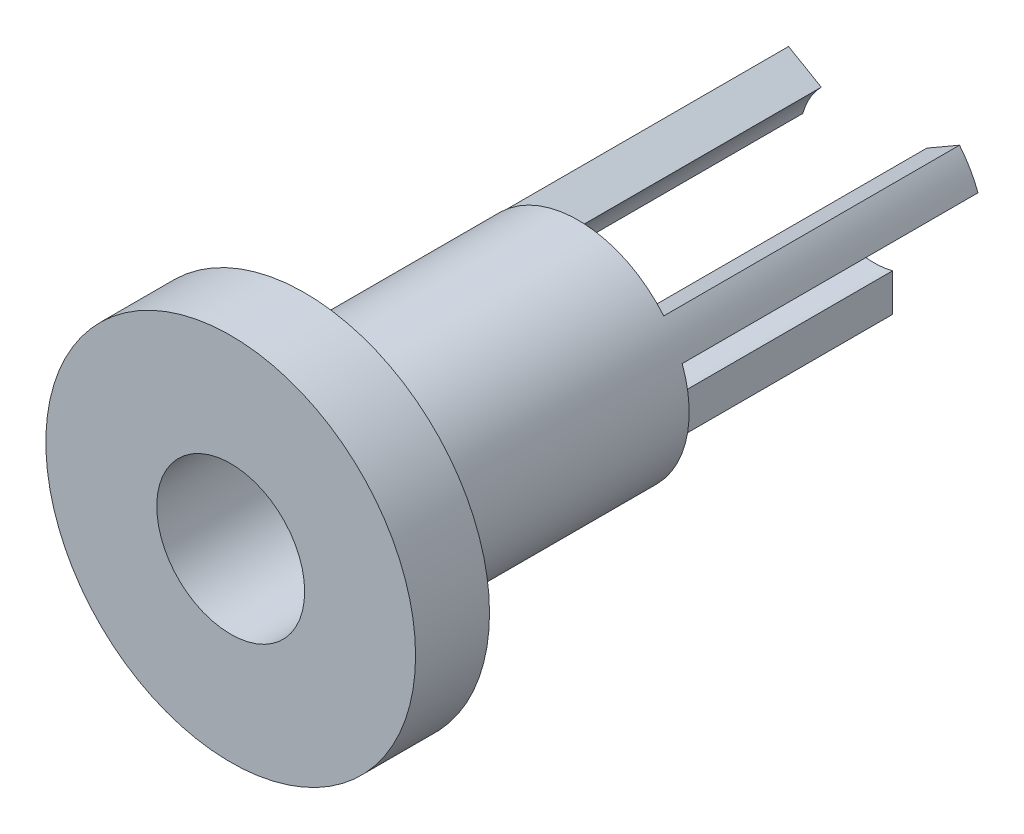
ISO-10303-21;
HEADER;
FILE_DESCRIPTION(('STEP AP214'),'2;1');
FILE_NAME('part.step','',(''),(''),'','','');
FILE_SCHEMA(('AUTOMOTIVE_DESIGN { 1 0 10303 214 1 1 1 1 }'));
ENDSEC;
DATA;
#1=APPLICATION_CONTEXT('core data for automotive mechanical design processes');
#2=APPLICATION_PROTOCOL_DEFINITION('international standard','automotive_design',2000,#1);
#3=PRODUCT_CONTEXT('',#1,'mechanical');
#4=PRODUCT('Part','Part','',(#3));
#5=PRODUCT_RELATED_PRODUCT_CATEGORY('part','',(#4));
#6=PRODUCT_DEFINITION_FORMATION('','',#4);
#7=PRODUCT_DEFINITION_CONTEXT('part definition',#1,'design');
#8=PRODUCT_DEFINITION('design','',#6,#7);
#9=PRODUCT_DEFINITION_SHAPE('','',#8);
#10=(LENGTH_UNIT() NAMED_UNIT(*) SI_UNIT(.MILLI.,.METRE.));
#11=(NAMED_UNIT(*) PLANE_ANGLE_UNIT() SI_UNIT($,.RADIAN.));
#12=(NAMED_UNIT(*) SI_UNIT($,.STERADIAN.) SOLID_ANGLE_UNIT());
#13=UNCERTAINTY_MEASURE_WITH_UNIT(LENGTH_MEASURE(1.E-05),#10,'distance_accuracy_value','');
#14=(GEOMETRIC_REPRESENTATION_CONTEXT(3) GLOBAL_UNCERTAINTY_ASSIGNED_CONTEXT((#13)) GLOBAL_UNIT_ASSIGNED_CONTEXT((#10,
#11,#12)) REPRESENTATION_CONTEXT('',''));
#15=CARTESIAN_POINT('',(0.,0.,0.));
#16=DIRECTION('',(0.,0.,1.));
#17=DIRECTION('',(1.,0.,0.));
#18=AXIS2_PLACEMENT_3D('',#15,#16,#17);
#19=CARTESIAN_POINT('',(0.,0.,0.));
#20=DIRECTION('',(0.,0.,1.));
#21=DIRECTION('',(1.,0.,0.));
#22=AXIS2_PLACEMENT_3D('',#19,#20,#21);
#23=PLANE('',#22);
#24=DIRECTION('',(0.,-1.,0.));
#25=VECTOR('',#24,1.);
#26=CARTESIAN_POINT('',(0.125,0.,0.));
#27=LINE('',#26,#25);
#28=CARTESIAN_POINT('',(0.125,-0.484122918275927,0.));
#29=VERTEX_POINT('',#28);
#30=CARTESIAN_POINT('',(0.125,-0.739509972887452,0.));
#31=VERTEX_POINT('',#30);
#32=EDGE_CURVE('E150',#29,#31,#27,.T.);
#33=ORIENTED_EDGE('',*,*,#32,.F.);
#34=CARTESIAN_POINT('',(0.,0.,0.));
#35=DIRECTION('',(0.,0.,1.));
#36=DIRECTION('',(1.,0.,0.));
#37=AXIS2_PLACEMENT_3D('',#34,#35,#36);
#38=CIRCLE('',#37,0.5);
#39=CARTESIAN_POINT('',(0.48176274578121,0.133808283664911,0.));
#40=VERTEX_POINT('',#39);
#41=EDGE_CURVE('E223',#29,#40,#38,.T.);
#42=ORIENTED_EDGE('',*,*,#41,.T.);
#43=DIRECTION('',(-0.866025403784436,-0.500000000000004,0.));
#44=VECTOR('',#43,1.);
#45=CARTESIAN_POINT('',(0.0625000000000004,-0.108253175473054,0.));
#46=LINE('',#45,#44);
#47=CARTESIAN_POINT('',(0.702934422872474,0.261501810970674,0.));
#48=VERTEX_POINT('',#47);
#49=EDGE_CURVE('E189',#48,#40,#46,.T.);
#50=ORIENTED_EDGE('',*,*,#49,.F.);
#51=CARTESIAN_POINT('',(0.,0.,0.));
#52=DIRECTION('',(0.,0.,1.));
#53=DIRECTION('',(1.,0.,0.));
#54=AXIS2_PLACEMENT_3D('',#51,#52,#53);
#55=CIRCLE('',#54,0.75);
#56=EDGE_CURVE('E51',#31,#48,#55,.T.);
#57=ORIENTED_EDGE('',*,*,#56,.F.);
#58=EDGE_LOOP('',(#33,#42,#50,#57));
#59=FACE_BOUND('',#58,.T.);
#60=ADVANCED_FACE('F36',(#59),#23,.F.);
#61=DIRECTION('',(0.866025403784443,-0.499999999999993,0.));
#62=VECTOR('',#61,1.);
#63=CARTESIAN_POINT('',(0.0625000000000023,0.108253175473061,0.));
#64=LINE('',#63,#62);
#65=CARTESIAN_POINT('',(-0.577934422872475,0.478008161916781,0.));
#66=VERTEX_POINT('',#65);
#67=CARTESIAN_POINT('',(-0.356762745781209,0.35031463461102,0.));
#68=VERTEX_POINT('',#67);
#69=EDGE_CURVE('E167',#66,#68,#64,.T.);
#70=ORIENTED_EDGE('',*,*,#69,.F.);
#71=CARTESIAN_POINT('',(0.577934422872473,0.478008161916783,0.));
#72=VERTEX_POINT('',#71);
#73=EDGE_CURVE('E40',#72,#66,#55,.T.);
#74=ORIENTED_EDGE('',*,*,#73,.F.);
#75=DIRECTION('',(-0.866025403784436,-0.500000000000004,0.));
#76=VECTOR('',#75,1.);
#77=CARTESIAN_POINT('',(-0.0625000000000004,0.108253175473054,0.));
#78=LINE('',#77,#76);
#79=CARTESIAN_POINT('',(0.356762745781209,0.35031463461102,0.));
#80=VERTEX_POINT('',#79);
#81=EDGE_CURVE('E194',#72,#80,#78,.T.);
#82=ORIENTED_EDGE('',*,*,#81,.T.);
#83=EDGE_CURVE('E226',#80,#68,#38,.T.);
#84=ORIENTED_EDGE('',*,*,#83,.T.);
#85=EDGE_LOOP('',(#70,#74,#82,#84));
#86=FACE_BOUND('',#85,.T.);
#87=ADVANCED_FACE('F255',(#86),#23,.F.);
#88=CARTESIAN_POINT('',(-0.48176274578121,0.133808283664912,0.));
#89=VERTEX_POINT('',#88);
#90=CARTESIAN_POINT('',(-0.125,-0.484122918275927,0.));
#91=VERTEX_POINT('',#90);
#92=EDGE_CURVE('E227',#89,#91,#38,.T.);
#93=ORIENTED_EDGE('',*,*,#92,.T.);
#94=DIRECTION('',(0.,-1.,0.));
#95=VECTOR('',#94,1.);
#96=CARTESIAN_POINT('',(-0.125,0.,0.));
#97=LINE('',#96,#95);
#98=CARTESIAN_POINT('',(-0.125,-0.739509972887452,0.));
#99=VERTEX_POINT('',#98);
#100=EDGE_CURVE('E59',#91,#99,#97,.T.);
#101=ORIENTED_EDGE('',*,*,#100,.T.);
#102=CARTESIAN_POINT('',(-0.702934422872475,0.261501810970671,0.));
#103=VERTEX_POINT('',#102);
#104=EDGE_CURVE('E229',#103,#99,#55,.T.);
#105=ORIENTED_EDGE('',*,*,#104,.F.);
#106=DIRECTION('',(0.866025403784444,-0.49999999999999,0.));
#107=VECTOR('',#106,1.);
#108=CARTESIAN_POINT('',(-0.0624999999999945,-0.108253175473048,0.));
#109=LINE('',#108,#107);
#110=EDGE_CURVE('E133',#103,#89,#109,.T.);
#111=ORIENTED_EDGE('',*,*,#110,.T.);
#112=EDGE_LOOP('',(#93,#101,#105,#111));
#113=FACE_BOUND('',#112,.T.);
#114=ADVANCED_FACE('F256',(#113),#23,.F.);
#115=CARTESIAN_POINT('',(0.,0.,1.85));
#116=DIRECTION('',(0.,0.,-1.));
#117=DIRECTION('',(-1.,0.,0.));
#118=AXIS2_PLACEMENT_3D('',#115,#116,#117);
#119=CYLINDRICAL_SURFACE('',#118,0.75);
#120=CARTESIAN_POINT('',(0.,0.,1.85));
#121=DIRECTION('',(0.,0.,1.));
#122=DIRECTION('',(1.,0.,0.));
#123=AXIS2_PLACEMENT_3D('',#120,#121,#122);
#124=CIRCLE('',#123,0.75);
#125=CARTESIAN_POINT('',(0.75,0.,1.85));
#126=VERTEX_POINT('',#125);
#127=EDGE_CURVE('E11',#126,#126,#124,.T.);
#128=ORIENTED_EDGE('',*,*,#127,.F.);
#129=EDGE_LOOP('',(#128));
#130=FACE_BOUND('',#129,.T.);
#131=ORIENTED_EDGE('',*,*,#73,.T.);
#132=DIRECTION('',(0.,0.,1.));
#133=VECTOR('',#132,1.);
#134=CARTESIAN_POINT('',(-0.577934422872475,0.478008161916781,-2.));
#135=LINE('',#134,#133);
#136=CARTESIAN_POINT('',(-0.577934422872475,0.478008161916781,-2.));
#137=VERTEX_POINT('',#136);
#138=EDGE_CURVE('E183',#137,#66,#135,.T.);
#139=ORIENTED_EDGE('',*,*,#138,.F.);
#140=CARTESIAN_POINT('',(0.,0.,-2.));
#141=DIRECTION('',(0.,0.,-1.));
#142=DIRECTION('',(-1.,0.,0.));
#143=AXIS2_PLACEMENT_3D('',#140,#141,#142);
#144=CIRCLE('',#143,0.75);
#145=CARTESIAN_POINT('',(-0.702934422872475,0.261501810970671,-2.));
#146=VERTEX_POINT('',#145);
#147=EDGE_CURVE('E166',#146,#137,#144,.T.);
#148=ORIENTED_EDGE('',*,*,#147,.F.);
#149=DIRECTION('',(0.,0.,1.));
#150=VECTOR('',#149,1.);
#151=CARTESIAN_POINT('',(-0.702934422872475,0.261501810970671,-2.));
#152=LINE('',#151,#150);
#153=EDGE_CURVE('E186',#146,#103,#152,.T.);
#154=ORIENTED_EDGE('',*,*,#153,.T.);
#155=ORIENTED_EDGE('',*,*,#104,.T.);
#156=DIRECTION('',(0.,0.,1.));
#157=VECTOR('',#156,1.);
#158=CARTESIAN_POINT('',(-0.125,-0.739509972887452,-2.));
#159=LINE('',#158,#157);
#160=CARTESIAN_POINT('',(-0.125,-0.739509972887452,-2.));
#161=VERTEX_POINT('',#160);
#162=EDGE_CURVE('E156',#161,#99,#159,.T.);
#163=ORIENTED_EDGE('',*,*,#162,.F.);
#164=CARTESIAN_POINT('',(0.,0.,-2.));
#165=DIRECTION('',(0.,0.,-1.));
#166=DIRECTION('',(-1.,0.,0.));
#167=AXIS2_PLACEMENT_3D('',#164,#165,#166);
#168=CIRCLE('',#167,0.75);
#169=CARTESIAN_POINT('',(0.125,-0.739509972887452,-2.));
#170=VERTEX_POINT('',#169);
#171=EDGE_CURVE('E148',#170,#161,#168,.T.);
#172=ORIENTED_EDGE('',*,*,#171,.F.);
#173=DIRECTION('',(0.,0.,1.));
#174=VECTOR('',#173,1.);
#175=CARTESIAN_POINT('',(0.125,-0.739509972887452,-2.));
#176=LINE('',#175,#174);
#177=EDGE_CURVE('E159',#170,#31,#176,.T.);
#178=ORIENTED_EDGE('',*,*,#177,.T.);
#179=ORIENTED_EDGE('',*,*,#56,.T.);
#180=DIRECTION('',(0.,0.,1.));
#181=VECTOR('',#180,1.);
#182=CARTESIAN_POINT('',(0.702934422872474,0.261501810970674,-2.));
#183=LINE('',#182,#181);
#184=CARTESIAN_POINT('',(0.702934422872474,0.261501810970674,-2.));
#185=VERTEX_POINT('',#184);
#186=EDGE_CURVE('E213',#185,#48,#183,.T.);
#187=ORIENTED_EDGE('',*,*,#186,.F.);
#188=CARTESIAN_POINT('',(0.,0.,-2.));
#189=DIRECTION('',(0.,0.,-1.));
#190=DIRECTION('',(-1.,0.,0.));
#191=AXIS2_PLACEMENT_3D('',#188,#189,#190);
#192=CIRCLE('',#191,0.75);
#193=CARTESIAN_POINT('',(0.577934422872473,0.478008161916783,-2.));
#194=VERTEX_POINT('',#193);
#195=EDGE_CURVE('E190',#194,#185,#192,.T.);
#196=ORIENTED_EDGE('',*,*,#195,.F.);
#197=DIRECTION('',(0.,0.,1.));
#198=VECTOR('',#197,1.);
#199=CARTESIAN_POINT('',(0.577934422872473,0.478008161916783,-2.));
#200=LINE('',#199,#198);
#201=EDGE_CURVE('E201',#194,#72,#200,.T.);
#202=ORIENTED_EDGE('',*,*,#201,.T.);
#203=EDGE_LOOP('',(#131,#139,#148,#154,#155,#163,#172,#178,#179,#187,#196,#202));
#204=FACE_BOUND('',#203,.T.);
#205=ADVANCED_FACE('F38',(#130,#204),#119,.T.);
#206=CARTESIAN_POINT('',(0.,0.,1.85));
#207=DIRECTION('',(0.,0.,-1.));
#208=DIRECTION('',(-1.,0.,0.));
#209=AXIS2_PLACEMENT_3D('',#206,#207,#208);
#210=CYLINDRICAL_SURFACE('',#209,0.5);
#211=ORIENTED_EDGE('',*,*,#83,.F.);
#212=DIRECTION('',(0.,0.,1.));
#213=VECTOR('',#212,1.);
#214=CARTESIAN_POINT('',(0.356762745781209,0.35031463461102,-2.));
#215=LINE('',#214,#213);
#216=CARTESIAN_POINT('',(0.356762745781209,0.35031463461102,-2.));
#217=VERTEX_POINT('',#216);
#218=EDGE_CURVE('E207',#217,#80,#215,.T.);
#219=ORIENTED_EDGE('',*,*,#218,.F.);
#220=CARTESIAN_POINT('',(0.,0.,-2.));
#221=DIRECTION('',(0.,0.,-1.));
#222=DIRECTION('',(-1.,0.,0.));
#223=AXIS2_PLACEMENT_3D('',#220,#221,#222);
#224=CIRCLE('',#223,0.5);
#225=CARTESIAN_POINT('',(0.48176274578121,0.133808283664911,-2.));
#226=VERTEX_POINT('',#225);
#227=EDGE_CURVE('E196',#226,#217,#224,.F.);
#228=ORIENTED_EDGE('',*,*,#227,.F.);
#229=DIRECTION('',(0.,0.,1.));
#230=VECTOR('',#229,1.);
#231=CARTESIAN_POINT('',(0.48176274578121,0.133808283664911,-2.));
#232=LINE('',#231,#230);
#233=EDGE_CURVE('E210',#226,#40,#232,.T.);
#234=ORIENTED_EDGE('',*,*,#233,.T.);
#235=ORIENTED_EDGE('',*,*,#41,.F.);
#236=DIRECTION('',(0.,0.,1.));
#237=VECTOR('',#236,1.);
#238=CARTESIAN_POINT('',(0.125,-0.484122918275927,-2.));
#239=LINE('',#238,#237);
#240=CARTESIAN_POINT('',(0.125,-0.484122918275927,-2.));
#241=VERTEX_POINT('',#240);
#242=EDGE_CURVE('E134',#241,#29,#239,.T.);
#243=ORIENTED_EDGE('',*,*,#242,.F.);
#244=CARTESIAN_POINT('',(0.,0.,-2.));
#245=DIRECTION('',(0.,0.,-1.));
#246=DIRECTION('',(-1.,0.,0.));
#247=AXIS2_PLACEMENT_3D('',#244,#245,#246);
#248=CIRCLE('',#247,0.5);
#249=CARTESIAN_POINT('',(-0.125,-0.484122918275927,-2.));
#250=VERTEX_POINT('',#249);
#251=EDGE_CURVE('E137',#250,#241,#248,.F.);
#252=ORIENTED_EDGE('',*,*,#251,.F.);
#253=DIRECTION('',(0.,0.,1.));
#254=VECTOR('',#253,1.);
#255=CARTESIAN_POINT('',(-0.125,-0.484122918275927,-2.));
#256=LINE('',#255,#254);
#257=EDGE_CURVE('E126',#250,#91,#256,.T.);
#258=ORIENTED_EDGE('',*,*,#257,.T.);
#259=ORIENTED_EDGE('',*,*,#92,.F.);
#260=DIRECTION('',(0.,0.,1.));
#261=VECTOR('',#260,1.);
#262=CARTESIAN_POINT('',(-0.48176274578121,0.133808283664912,-2.));
#263=LINE('',#262,#261);
#264=CARTESIAN_POINT('',(-0.48176274578121,0.133808283664912,-2.));
#265=VERTEX_POINT('',#264);
#266=EDGE_CURVE('E173',#265,#89,#263,.T.);
#267=ORIENTED_EDGE('',*,*,#266,.F.);
#268=CARTESIAN_POINT('',(0.,0.,-2.));
#269=DIRECTION('',(0.,0.,-1.));
#270=DIRECTION('',(-1.,0.,0.));
#271=AXIS2_PLACEMENT_3D('',#268,#269,#270);
#272=CIRCLE('',#271,0.5);
#273=CARTESIAN_POINT('',(-0.356762745781209,0.35031463461102,-2.));
#274=VERTEX_POINT('',#273);
#275=EDGE_CURVE('E171',#274,#265,#272,.F.);
#276=ORIENTED_EDGE('',*,*,#275,.F.);
#277=DIRECTION('',(0.,0.,1.));
#278=VECTOR('',#277,1.);
#279=CARTESIAN_POINT('',(-0.356762745781209,0.35031463461102,-2.));
#280=LINE('',#279,#278);
#281=EDGE_CURVE('E180',#274,#68,#280,.T.);
#282=ORIENTED_EDGE('',*,*,#281,.T.);
#283=EDGE_LOOP('',(#211,#219,#228,#234,#235,#243,#252,#258,#259,#267,#276,#282));
#284=FACE_BOUND('',#283,.T.);
#285=CARTESIAN_POINT('',(0.,0.,2.35));
#286=DIRECTION('',(0.,0.,1.));
#287=DIRECTION('',(1.,0.,0.));
#288=AXIS2_PLACEMENT_3D('',#285,#286,#287);
#289=CIRCLE('',#288,0.5);
#290=CARTESIAN_POINT('',(0.5,0.,2.35));
#291=VERTEX_POINT('',#290);
#292=EDGE_CURVE('E216',#291,#291,#289,.T.);
#293=ORIENTED_EDGE('',*,*,#292,.T.);
#294=EDGE_LOOP('',(#293));
#295=FACE_BOUND('',#294,.T.);
#296=ADVANCED_FACE('F139',(#284,#295),#210,.F.);
#297=CARTESIAN_POINT('',(0.,0.,1.85));
#298=DIRECTION('',(0.,0.,1.));
#299=DIRECTION('',(1.,0.,0.));
#300=AXIS2_PLACEMENT_3D('',#297,#298,#299);
#301=PLANE('',#300);
#302=CARTESIAN_POINT('',(0.,0.,1.85));
#303=DIRECTION('',(0.,0.,1.));
#304=DIRECTION('',(1.,0.,0.));
#305=AXIS2_PLACEMENT_3D('',#302,#303,#304);
#306=CIRCLE('',#305,1.25);
#307=CARTESIAN_POINT('',(1.25,0.,1.85));
#308=VERTEX_POINT('',#307);
#309=EDGE_CURVE('E219',#308,#308,#306,.T.);
#310=ORIENTED_EDGE('',*,*,#309,.F.);
#311=EDGE_LOOP('',(#310));
#312=FACE_BOUND('',#311,.T.);
#313=ORIENTED_EDGE('',*,*,#127,.T.);
#314=EDGE_LOOP('',(#313));
#315=FACE_BOUND('',#314,.T.);
#316=ADVANCED_FACE('F296',(#312,#315),#301,.F.);
#317=CARTESIAN_POINT('',(0.,0.,2.35));
#318=DIRECTION('',(0.,0.,1.));
#319=DIRECTION('',(1.,0.,0.));
#320=AXIS2_PLACEMENT_3D('',#317,#318,#319);
#321=PLANE('',#320);
#322=CARTESIAN_POINT('',(0.,0.,2.35));
#323=DIRECTION('',(0.,0.,1.));
#324=DIRECTION('',(1.,0.,0.));
#325=AXIS2_PLACEMENT_3D('',#322,#323,#324);
#326=CIRCLE('',#325,1.25);
#327=CARTESIAN_POINT('',(1.25,0.,2.35));
#328=VERTEX_POINT('',#327);
#329=EDGE_CURVE('E220',#328,#328,#326,.T.);
#330=ORIENTED_EDGE('',*,*,#329,.T.);
#331=EDGE_LOOP('',(#330));
#332=FACE_BOUND('',#331,.T.);
#333=ORIENTED_EDGE('',*,*,#292,.F.);
#334=EDGE_LOOP('',(#333));
#335=FACE_BOUND('',#334,.T.);
#336=ADVANCED_FACE('F293',(#332,#335),#321,.T.);
#337=CARTESIAN_POINT('',(0.,0.,2.35));
#338=DIRECTION('',(0.,0.,-1.));
#339=DIRECTION('',(-1.,0.,0.));
#340=AXIS2_PLACEMENT_3D('',#337,#338,#339);
#341=CYLINDRICAL_SURFACE('',#340,1.25);
#342=ORIENTED_EDGE('',*,*,#329,.F.);
#343=EDGE_LOOP('',(#342));
#344=FACE_BOUND('',#343,.T.);
#345=ORIENTED_EDGE('',*,*,#309,.T.);
#346=EDGE_LOOP('',(#345));
#347=FACE_BOUND('',#346,.T.);
#348=ADVANCED_FACE('F289',(#344,#347),#341,.T.);
#349=CARTESIAN_POINT('',(0.0625000000000004,-0.108253175473054,-2.));
#350=DIRECTION('',(-0.500000000000004,0.866025403784436,0.));
#351=DIRECTION('',(-0.866025403784436,-0.500000000000004,0.));
#352=AXIS2_PLACEMENT_3D('',#349,#350,#351);
#353=PLANE('',#352);
#354=ORIENTED_EDGE('',*,*,#49,.T.);
#355=ORIENTED_EDGE('',*,*,#233,.F.);
#356=DIRECTION('',(-0.866025403784436,-0.500000000000004,0.));
#357=VECTOR('',#356,1.);
#358=CARTESIAN_POINT('',(0.0625000000000004,-0.108253175473054,-2.));
#359=LINE('',#358,#357);
#360=EDGE_CURVE('E193',#185,#226,#359,.T.);
#361=ORIENTED_EDGE('',*,*,#360,.F.);
#362=ORIENTED_EDGE('',*,*,#186,.T.);
#363=EDGE_LOOP('',(#354,#355,#361,#362));
#364=FACE_BOUND('',#363,.T.);
#365=ADVANCED_FACE('F232',(#364),#353,.F.);
#366=CARTESIAN_POINT('',(-0.0625000000000004,0.108253175473054,-2.));
#367=DIRECTION('',(-0.500000000000004,0.866025403784436,0.));
#368=DIRECTION('',(-0.866025403784436,-0.500000000000004,0.));
#369=AXIS2_PLACEMENT_3D('',#366,#367,#368);
#370=PLANE('',#369);
#371=ORIENTED_EDGE('',*,*,#81,.F.);
#372=ORIENTED_EDGE('',*,*,#201,.F.);
#373=DIRECTION('',(-0.866025403784436,-0.500000000000004,0.));
#374=VECTOR('',#373,1.);
#375=CARTESIAN_POINT('',(-0.0625000000000004,0.108253175473054,-2.));
#376=LINE('',#375,#374);
#377=EDGE_CURVE('E198',#194,#217,#376,.T.);
#378=ORIENTED_EDGE('',*,*,#377,.T.);
#379=ORIENTED_EDGE('',*,*,#218,.T.);
#380=EDGE_LOOP('',(#371,#372,#378,#379));
#381=FACE_BOUND('',#380,.T.);
#382=ADVANCED_FACE('F281',(#381),#370,.T.);
#383=CARTESIAN_POINT('',(0.,0.,-2.));
#384=DIRECTION('',(0.,0.,-1.));
#385=DIRECTION('',(-1.,0.,0.));
#386=AXIS2_PLACEMENT_3D('',#383,#384,#385);
#387=PLANE('',#386);
#388=ORIENTED_EDGE('',*,*,#195,.T.);
#389=ORIENTED_EDGE('',*,*,#360,.T.);
#390=ORIENTED_EDGE('',*,*,#227,.T.);
#391=ORIENTED_EDGE('',*,*,#377,.F.);
#392=EDGE_LOOP('',(#388,#389,#390,#391));
#393=FACE_BOUND('',#392,.T.);
#394=ADVANCED_FACE('F238',(#393),#387,.T.);
#395=CARTESIAN_POINT('',(-0.0624999999999945,-0.108253175473048,-2.));
#396=DIRECTION('',(-0.49999999999999,-0.866025403784444,0.));
#397=DIRECTION('',(0.866025403784444,-0.49999999999999,0.));
#398=AXIS2_PLACEMENT_3D('',#395,#396,#397);
#399=PLANE('',#398);
#400=ORIENTED_EDGE('',*,*,#110,.F.);
#401=ORIENTED_EDGE('',*,*,#153,.F.);
#402=DIRECTION('',(0.866025403784444,-0.49999999999999,0.));
#403=VECTOR('',#402,1.);
#404=CARTESIAN_POINT('',(-0.0624999999999945,-0.108253175473048,-2.));
#405=LINE('',#404,#403);
#406=EDGE_CURVE('E163',#146,#265,#405,.T.);
#407=ORIENTED_EDGE('',*,*,#406,.T.);
#408=ORIENTED_EDGE('',*,*,#266,.T.);
#409=EDGE_LOOP('',(#400,#401,#407,#408));
#410=FACE_BOUND('',#409,.T.);
#411=ADVANCED_FACE('F271',(#410),#399,.T.);
#412=CARTESIAN_POINT('',(0.0625000000000023,0.108253175473061,-2.));
#413=DIRECTION('',(-0.499999999999993,-0.866025403784443,0.));
#414=DIRECTION('',(0.866025403784443,-0.499999999999993,0.));
#415=AXIS2_PLACEMENT_3D('',#412,#413,#414);
#416=PLANE('',#415);
#417=ORIENTED_EDGE('',*,*,#69,.T.);
#418=ORIENTED_EDGE('',*,*,#281,.F.);
#419=DIRECTION('',(0.866025403784443,-0.499999999999993,0.));
#420=VECTOR('',#419,1.);
#421=CARTESIAN_POINT('',(0.0625000000000023,0.108253175473061,-2.));
#422=LINE('',#421,#420);
#423=EDGE_CURVE('E169',#137,#274,#422,.T.);
#424=ORIENTED_EDGE('',*,*,#423,.F.);
#425=ORIENTED_EDGE('',*,*,#138,.T.);
#426=EDGE_LOOP('',(#417,#418,#424,#425));
#427=FACE_BOUND('',#426,.T.);
#428=ADVANCED_FACE('F278',(#427),#416,.F.);
#429=CARTESIAN_POINT('',(0.,0.,-2.));
#430=DIRECTION('',(0.,0.,-1.));
#431=DIRECTION('',(-1.,0.,0.));
#432=AXIS2_PLACEMENT_3D('',#429,#430,#431);
#433=PLANE('',#432);
#434=ORIENTED_EDGE('',*,*,#406,.F.);
#435=ORIENTED_EDGE('',*,*,#147,.T.);
#436=ORIENTED_EDGE('',*,*,#423,.T.);
#437=ORIENTED_EDGE('',*,*,#275,.T.);
#438=EDGE_LOOP('',(#434,#435,#436,#437));
#439=FACE_BOUND('',#438,.T.);
#440=ADVANCED_FACE('F252',(#439),#433,.T.);
#441=CARTESIAN_POINT('',(-0.125,0.,-2.));
#442=DIRECTION('',(-1.,0.,0.));
#443=DIRECTION('',(0.,-1.,0.));
#444=AXIS2_PLACEMENT_3D('',#441,#442,#443);
#445=PLANE('',#444);
#446=ORIENTED_EDGE('',*,*,#100,.F.);
#447=ORIENTED_EDGE('',*,*,#257,.F.);
#448=DIRECTION('',(0.,-1.,0.));
#449=VECTOR('',#448,1.);
#450=CARTESIAN_POINT('',(-0.125,0.,-2.));
#451=LINE('',#450,#449);
#452=EDGE_CURVE('E131',#250,#161,#451,.T.);
#453=ORIENTED_EDGE('',*,*,#452,.T.);
#454=ORIENTED_EDGE('',*,*,#162,.T.);
#455=EDGE_LOOP('',(#446,#447,#453,#454));
#456=FACE_BOUND('',#455,.T.);
#457=ADVANCED_FACE('F128',(#456),#445,.T.);
#458=CARTESIAN_POINT('',(0.125,0.,-2.));
#459=DIRECTION('',(-1.,0.,0.));
#460=DIRECTION('',(0.,-1.,0.));
#461=AXIS2_PLACEMENT_3D('',#458,#459,#460);
#462=PLANE('',#461);
#463=ORIENTED_EDGE('',*,*,#32,.T.);
#464=ORIENTED_EDGE('',*,*,#177,.F.);
#465=DIRECTION('',(0.,-1.,0.));
#466=VECTOR('',#465,1.);
#467=CARTESIAN_POINT('',(0.125,0.,-2.));
#468=LINE('',#467,#466);
#469=EDGE_CURVE('E144',#241,#170,#468,.T.);
#470=ORIENTED_EDGE('',*,*,#469,.F.);
#471=ORIENTED_EDGE('',*,*,#242,.T.);
#472=EDGE_LOOP('',(#463,#464,#470,#471));
#473=FACE_BOUND('',#472,.T.);
#474=ADVANCED_FACE('F244',(#473),#462,.F.);
#475=CARTESIAN_POINT('',(0.,0.,-2.));
#476=DIRECTION('',(0.,0.,-1.));
#477=DIRECTION('',(-1.,0.,0.));
#478=AXIS2_PLACEMENT_3D('',#475,#476,#477);
#479=PLANE('',#478);
#480=ORIENTED_EDGE('',*,*,#452,.F.);
#481=ORIENTED_EDGE('',*,*,#251,.T.);
#482=ORIENTED_EDGE('',*,*,#469,.T.);
#483=ORIENTED_EDGE('',*,*,#171,.T.);
#484=EDGE_LOOP('',(#480,#481,#482,#483));
#485=FACE_BOUND('',#484,.T.);
#486=ADVANCED_FACE('F146',(#485),#479,.T.);
#487=CLOSED_SHELL('',(#60,#87,#114,#205,#296,#316,#336,#348,#365,#382,#394,#411,#428,#440,#457,
#474,#486));
#488=MANIFOLD_SOLID_BREP('B2',#487);
#489=ADVANCED_BREP_SHAPE_REPRESENTATION('',(#18,#488),#14);
#490=SHAPE_DEFINITION_REPRESENTATION(#9,#489);
ENDSEC;
END-ISO-10303-21;
